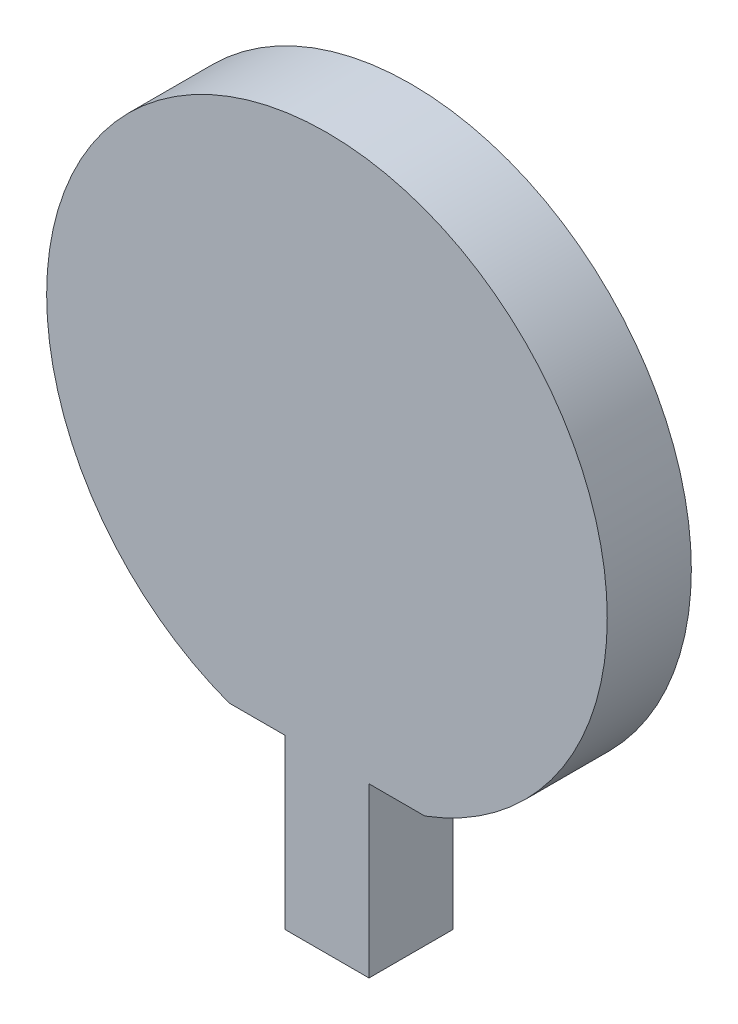
ISO-10303-21;
HEADER;
FILE_DESCRIPTION(('STEP AP214'),'2;1');
FILE_NAME('part.step','',(''),(''),'','','');
FILE_SCHEMA(('AUTOMOTIVE_DESIGN { 1 0 10303 214 1 1 1 1 }'));
ENDSEC;
DATA;
#1=APPLICATION_CONTEXT('core data for automotive mechanical design processes');
#2=APPLICATION_PROTOCOL_DEFINITION('international standard','automotive_design',2000,#1);
#3=PRODUCT_CONTEXT('',#1,'mechanical');
#4=PRODUCT('Part','Part','',(#3));
#5=PRODUCT_RELATED_PRODUCT_CATEGORY('part','',(#4));
#6=PRODUCT_DEFINITION_FORMATION('','',#4);
#7=PRODUCT_DEFINITION_CONTEXT('part definition',#1,'design');
#8=PRODUCT_DEFINITION('design','',#6,#7);
#9=PRODUCT_DEFINITION_SHAPE('','',#8);
#10=(LENGTH_UNIT() NAMED_UNIT(*) SI_UNIT(.MILLI.,.METRE.));
#11=(NAMED_UNIT(*) PLANE_ANGLE_UNIT() SI_UNIT($,.RADIAN.));
#12=(NAMED_UNIT(*) SI_UNIT($,.STERADIAN.) SOLID_ANGLE_UNIT());
#13=UNCERTAINTY_MEASURE_WITH_UNIT(LENGTH_MEASURE(1.E-05),#10,'distance_accuracy_value','');
#14=(GEOMETRIC_REPRESENTATION_CONTEXT(3) GLOBAL_UNCERTAINTY_ASSIGNED_CONTEXT((#13)) GLOBAL_UNIT_ASSIGNED_CONTEXT((#10,
#11,#12)) REPRESENTATION_CONTEXT('',''));
#15=CARTESIAN_POINT('',(0.,0.,0.));
#16=DIRECTION('',(0.,0.,1.));
#17=DIRECTION('',(1.,0.,0.));
#18=AXIS2_PLACEMENT_3D('',#15,#16,#17);
#19=CARTESIAN_POINT('',(7.5,76.8550623408927,15.));
#20=DIRECTION('',(0.,0.,-1.));
#21=DIRECTION('',(-1.,0.,0.));
#22=AXIS2_PLACEMENT_3D('',#19,#20,#21);
#23=CYLINDRICAL_SURFACE('',#22,50.);
#24=CARTESIAN_POINT('',(7.5,76.8550623408927,0.));
#25=DIRECTION('',(0.,0.,1.));
#26=DIRECTION('',(-1.,0.,0.));
#27=AXIS2_PLACEMENT_3D('',#24,#25,#26);
#28=CIRCLE('',#27,50.);
#29=CARTESIAN_POINT('',(24.9528832297434,30.,0.));
#30=VERTEX_POINT('',#29);
#31=CARTESIAN_POINT('',(-9.95288322974345,30.,0.));
#32=VERTEX_POINT('',#31);
#33=EDGE_CURVE('E117',#30,#32,#28,.T.);
#34=ORIENTED_EDGE('',*,*,#33,.T.);
#35=DIRECTION('',(0.,0.,-1.));
#36=VECTOR('',#35,1.);
#37=CARTESIAN_POINT('',(-9.95288322974345,30.,15.));
#38=LINE('',#37,#36);
#39=CARTESIAN_POINT('',(-9.95288322974345,30.,15.));
#40=VERTEX_POINT('',#39);
#41=EDGE_CURVE('E11',#40,#32,#38,.T.);
#42=ORIENTED_EDGE('',*,*,#41,.F.);
#43=CARTESIAN_POINT('',(7.5,76.8550623408927,15.));
#44=DIRECTION('',(0.,0.,1.));
#45=DIRECTION('',(-1.,0.,0.));
#46=AXIS2_PLACEMENT_3D('',#43,#44,#45);
#47=CIRCLE('',#46,50.);
#48=CARTESIAN_POINT('',(24.9528832297434,30.,15.));
#49=VERTEX_POINT('',#48);
#50=EDGE_CURVE('E127',#49,#40,#47,.T.);
#51=ORIENTED_EDGE('',*,*,#50,.F.);
#52=DIRECTION('',(0.,0.,-1.));
#53=VECTOR('',#52,1.);
#54=CARTESIAN_POINT('',(24.9528832297434,30.,15.));
#55=LINE('',#54,#53);
#56=EDGE_CURVE('E113',#49,#30,#55,.T.);
#57=ORIENTED_EDGE('',*,*,#56,.T.);
#58=EDGE_LOOP('',(#34,#42,#51,#57));
#59=FACE_BOUND('',#58,.T.);
#60=ADVANCED_FACE('F33',(#59),#23,.T.);
#61=CARTESIAN_POINT('',(-9.95288322974345,30.,15.));
#62=DIRECTION('',(0.,1.,0.));
#63=DIRECTION('',(0.,0.,1.));
#64=AXIS2_PLACEMENT_3D('',#61,#62,#63);
#65=PLANE('',#64);
#66=DIRECTION('',(1.,0.,0.));
#67=VECTOR('',#66,1.);
#68=CARTESIAN_POINT('',(-9.95288322974345,30.,0.));
#69=LINE('',#68,#67);
#70=CARTESIAN_POINT('',(0.,30.,0.));
#71=VERTEX_POINT('',#70);
#72=EDGE_CURVE('E120',#32,#71,#69,.T.);
#73=ORIENTED_EDGE('',*,*,#72,.T.);
#74=DIRECTION('',(0.,0.,-1.));
#75=VECTOR('',#74,1.);
#76=CARTESIAN_POINT('',(0.,30.,15.));
#77=LINE('',#76,#75);
#78=CARTESIAN_POINT('',(0.,30.,15.));
#79=VERTEX_POINT('',#78);
#80=EDGE_CURVE('E41',#79,#71,#77,.T.);
#81=ORIENTED_EDGE('',*,*,#80,.F.);
#82=DIRECTION('',(1.,0.,0.));
#83=VECTOR('',#82,1.);
#84=CARTESIAN_POINT('',(-9.95288322974345,30.,15.));
#85=LINE('',#84,#83);
#86=EDGE_CURVE('E86',#40,#79,#85,.T.);
#87=ORIENTED_EDGE('',*,*,#86,.F.);
#88=ORIENTED_EDGE('',*,*,#41,.T.);
#89=EDGE_LOOP('',(#73,#81,#87,#88));
#90=FACE_BOUND('',#89,.T.);
#91=ADVANCED_FACE('F151',(#90),#65,.F.);
#92=CARTESIAN_POINT('',(0.,30.,15.));
#93=DIRECTION('',(1.,0.,0.));
#94=DIRECTION('',(0.,0.,-1.));
#95=AXIS2_PLACEMENT_3D('',#92,#93,#94);
#96=PLANE('',#95);
#97=DIRECTION('',(0.,-1.,0.));
#98=VECTOR('',#97,1.);
#99=CARTESIAN_POINT('',(0.,30.,0.));
#100=LINE('',#99,#98);
#101=CARTESIAN_POINT('',(0.,0.,0.));
#102=VERTEX_POINT('',#101);
#103=EDGE_CURVE('E122',#71,#102,#100,.T.);
#104=ORIENTED_EDGE('',*,*,#103,.T.);
#105=DIRECTION('',(0.,0.,-1.));
#106=VECTOR('',#105,1.);
#107=CARTESIAN_POINT('',(0.,0.,15.));
#108=LINE('',#107,#106);
#109=CARTESIAN_POINT('',(0.,0.,15.));
#110=VERTEX_POINT('',#109);
#111=EDGE_CURVE('E108',#110,#102,#108,.T.);
#112=ORIENTED_EDGE('',*,*,#111,.F.);
#113=DIRECTION('',(0.,-1.,0.));
#114=VECTOR('',#113,1.);
#115=CARTESIAN_POINT('',(0.,30.,15.));
#116=LINE('',#115,#114);
#117=EDGE_CURVE('E99',#79,#110,#116,.T.);
#118=ORIENTED_EDGE('',*,*,#117,.F.);
#119=ORIENTED_EDGE('',*,*,#80,.T.);
#120=EDGE_LOOP('',(#104,#112,#118,#119));
#121=FACE_BOUND('',#120,.T.);
#122=ADVANCED_FACE('F133',(#121),#96,.F.);
#123=CARTESIAN_POINT('',(0.,0.,15.));
#124=DIRECTION('',(0.,1.,0.));
#125=DIRECTION('',(0.,0.,1.));
#126=AXIS2_PLACEMENT_3D('',#123,#124,#125);
#127=PLANE('',#126);
#128=DIRECTION('',(1.,0.,0.));
#129=VECTOR('',#128,1.);
#130=CARTESIAN_POINT('',(0.,0.,0.));
#131=LINE('',#130,#129);
#132=CARTESIAN_POINT('',(15.,0.,0.));
#133=VERTEX_POINT('',#132);
#134=EDGE_CURVE('E107',#102,#133,#131,.T.);
#135=ORIENTED_EDGE('',*,*,#134,.T.);
#136=DIRECTION('',(0.,0.,-1.));
#137=VECTOR('',#136,1.);
#138=CARTESIAN_POINT('',(15.,0.,15.));
#139=LINE('',#138,#137);
#140=CARTESIAN_POINT('',(15.,0.,15.));
#141=VERTEX_POINT('',#140);
#142=EDGE_CURVE('E104',#141,#133,#139,.T.);
#143=ORIENTED_EDGE('',*,*,#142,.F.);
#144=DIRECTION('',(1.,0.,0.));
#145=VECTOR('',#144,1.);
#146=CARTESIAN_POINT('',(0.,0.,15.));
#147=LINE('',#146,#145);
#148=EDGE_CURVE('E93',#110,#141,#147,.T.);
#149=ORIENTED_EDGE('',*,*,#148,.F.);
#150=ORIENTED_EDGE('',*,*,#111,.T.);
#151=EDGE_LOOP('',(#135,#143,#149,#150));
#152=FACE_BOUND('',#151,.T.);
#153=ADVANCED_FACE('F105',(#152),#127,.F.);
#154=CARTESIAN_POINT('',(15.,0.,15.));
#155=DIRECTION('',(-1.,0.,0.));
#156=DIRECTION('',(0.,0.,1.));
#157=AXIS2_PLACEMENT_3D('',#154,#155,#156);
#158=PLANE('',#157);
#159=DIRECTION('',(0.,1.,0.));
#160=VECTOR('',#159,1.);
#161=CARTESIAN_POINT('',(15.,0.,0.));
#162=LINE('',#161,#160);
#163=CARTESIAN_POINT('',(15.,30.,0.));
#164=VERTEX_POINT('',#163);
#165=EDGE_CURVE('E72',#133,#164,#162,.T.);
#166=ORIENTED_EDGE('',*,*,#165,.T.);
#167=DIRECTION('',(0.,0.,-1.));
#168=VECTOR('',#167,1.);
#169=CARTESIAN_POINT('',(15.,30.,15.));
#170=LINE('',#169,#168);
#171=CARTESIAN_POINT('',(15.,30.,15.));
#172=VERTEX_POINT('',#171);
#173=EDGE_CURVE('E109',#172,#164,#170,.T.);
#174=ORIENTED_EDGE('',*,*,#173,.F.);
#175=DIRECTION('',(0.,1.,0.));
#176=VECTOR('',#175,1.);
#177=CARTESIAN_POINT('',(15.,0.,15.));
#178=LINE('',#177,#176);
#179=EDGE_CURVE('E97',#141,#172,#178,.T.);
#180=ORIENTED_EDGE('',*,*,#179,.F.);
#181=ORIENTED_EDGE('',*,*,#142,.T.);
#182=EDGE_LOOP('',(#166,#174,#180,#181));
#183=FACE_BOUND('',#182,.T.);
#184=ADVANCED_FACE('F111',(#183),#158,.F.);
#185=CARTESIAN_POINT('',(15.,30.,15.));
#186=DIRECTION('',(0.,1.,0.));
#187=DIRECTION('',(-1.,0.,0.));
#188=AXIS2_PLACEMENT_3D('',#185,#186,#187);
#189=PLANE('',#188);
#190=DIRECTION('',(1.,0.,0.));
#191=VECTOR('',#190,1.);
#192=CARTESIAN_POINT('',(15.,30.,0.));
#193=LINE('',#192,#191);
#194=EDGE_CURVE('E78',#164,#30,#193,.T.);
#195=ORIENTED_EDGE('',*,*,#194,.T.);
#196=ORIENTED_EDGE('',*,*,#56,.F.);
#197=DIRECTION('',(1.,0.,0.));
#198=VECTOR('',#197,1.);
#199=CARTESIAN_POINT('',(15.,30.,15.));
#200=LINE('',#199,#198);
#201=EDGE_CURVE('E49',#172,#49,#200,.T.);
#202=ORIENTED_EDGE('',*,*,#201,.F.);
#203=ORIENTED_EDGE('',*,*,#173,.T.);
#204=EDGE_LOOP('',(#195,#196,#202,#203));
#205=FACE_BOUND('',#204,.T.);
#206=ADVANCED_FACE('F140',(#205),#189,.F.);
#207=CARTESIAN_POINT('',(7.5,76.8550623408927,15.));
#208=DIRECTION('',(0.,0.,-1.));
#209=DIRECTION('',(-1.,0.,0.));
#210=AXIS2_PLACEMENT_3D('',#207,#208,#209);
#211=PLANE('',#210);
#212=ORIENTED_EDGE('',*,*,#50,.T.);
#213=ORIENTED_EDGE('',*,*,#86,.T.);
#214=ORIENTED_EDGE('',*,*,#117,.T.);
#215=ORIENTED_EDGE('',*,*,#148,.T.);
#216=ORIENTED_EDGE('',*,*,#179,.T.);
#217=ORIENTED_EDGE('',*,*,#201,.T.);
#218=EDGE_LOOP('',(#212,#213,#214,#215,#216,#217));
#219=FACE_BOUND('',#218,.T.);
#220=ADVANCED_FACE('F95',(#219),#211,.F.);
#221=CARTESIAN_POINT('',(7.5,76.8550623408927,0.));
#222=DIRECTION('',(0.,0.,-1.));
#223=DIRECTION('',(-1.,0.,0.));
#224=AXIS2_PLACEMENT_3D('',#221,#222,#223);
#225=PLANE('',#224);
#226=ORIENTED_EDGE('',*,*,#33,.F.);
#227=ORIENTED_EDGE('',*,*,#194,.F.);
#228=ORIENTED_EDGE('',*,*,#165,.F.);
#229=ORIENTED_EDGE('',*,*,#134,.F.);
#230=ORIENTED_EDGE('',*,*,#103,.F.);
#231=ORIENTED_EDGE('',*,*,#72,.F.);
#232=EDGE_LOOP('',(#226,#227,#228,#229,#230,#231));
#233=FACE_BOUND('',#232,.T.);
#234=ADVANCED_FACE('F136',(#233),#225,.T.);
#235=CLOSED_SHELL('',(#60,#91,#122,#153,#184,#206,#220,#234));
#236=MANIFOLD_SOLID_BREP('B2',#235);
#237=ADVANCED_BREP_SHAPE_REPRESENTATION('',(#18,#236),#14);
#238=SHAPE_DEFINITION_REPRESENTATION(#9,#237);
ENDSEC;
END-ISO-10303-21;
